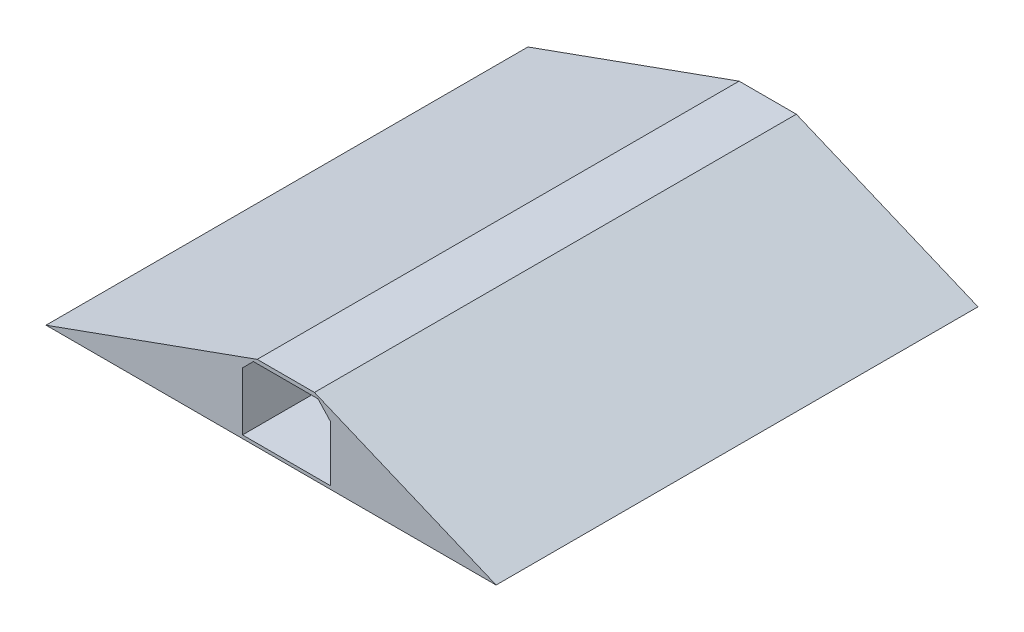
ISO-10303-21;
HEADER;
FILE_DESCRIPTION(('STEP AP214'),'2;1');
FILE_NAME('part.step','',(''),(''),'','','');
FILE_SCHEMA(('AUTOMOTIVE_DESIGN { 1 0 10303 214 1 1 1 1 }'));
ENDSEC;
DATA;
#1=APPLICATION_CONTEXT('core data for automotive mechanical design processes');
#2=APPLICATION_PROTOCOL_DEFINITION('international standard','automotive_design',2000,#1);
#3=PRODUCT_CONTEXT('',#1,'mechanical');
#4=PRODUCT('Part','Part','',(#3));
#5=PRODUCT_RELATED_PRODUCT_CATEGORY('part','',(#4));
#6=PRODUCT_DEFINITION_FORMATION('','',#4);
#7=PRODUCT_DEFINITION_CONTEXT('part definition',#1,'design');
#8=PRODUCT_DEFINITION('design','',#6,#7);
#9=PRODUCT_DEFINITION_SHAPE('','',#8);
#10=(LENGTH_UNIT() NAMED_UNIT(*) SI_UNIT(.MILLI.,.METRE.));
#11=(NAMED_UNIT(*) PLANE_ANGLE_UNIT() SI_UNIT($,.RADIAN.));
#12=(NAMED_UNIT(*) SI_UNIT($,.STERADIAN.) SOLID_ANGLE_UNIT());
#13=UNCERTAINTY_MEASURE_WITH_UNIT(LENGTH_MEASURE(1.E-05),#10,'distance_accuracy_value','');
#14=(GEOMETRIC_REPRESENTATION_CONTEXT(3) GLOBAL_UNCERTAINTY_ASSIGNED_CONTEXT((#13)) GLOBAL_UNIT_ASSIGNED_CONTEXT((#10,
#11,#12)) REPRESENTATION_CONTEXT('',''));
#15=CARTESIAN_POINT('',(0.,0.,0.));
#16=DIRECTION('',(0.,0.,1.));
#17=DIRECTION('',(1.,0.,0.));
#18=AXIS2_PLACEMENT_3D('',#15,#16,#17);
#19=CARTESIAN_POINT('',(0.,0.,55.));
#20=DIRECTION('',(0.,0.,1.));
#21=DIRECTION('',(1.,0.,0.));
#22=AXIS2_PLACEMENT_3D('',#19,#20,#21);
#23=PLANE('',#22);
#24=DIRECTION('',(1.,0.,0.));
#25=VECTOR('',#24,1.);
#26=CARTESIAN_POINT('',(-7.08566541011932,-21.0540046811793,55.));
#27=LINE('',#26,#25);
#28=CARTESIAN_POINT('',(-31.0856654101193,-21.0540046811793,55.));
#29=VERTEX_POINT('',#28);
#30=CARTESIAN_POINT('',(20.2873955088301,-21.0540046811793,55.));
#31=VERTEX_POINT('',#30);
#32=EDGE_CURVE('E163',#29,#31,#27,.T.);
#33=ORIENTED_EDGE('',*,*,#32,.T.);
#34=DIRECTION('',(-0.922510990792128,0.385970817378369,0.));
#35=VECTOR('',#34,1.);
#36=CARTESIAN_POINT('',(-0.444607291259682,-12.3799095793201,55.));
#37=LINE('',#36,#35);
#38=CARTESIAN_POINT('',(-0.444607291259682,-12.3799095793201,55.));
#39=VERTEX_POINT('',#38);
#40=EDGE_CURVE('E165',#31,#39,#37,.T.);
#41=ORIENTED_EDGE('',*,*,#40,.T.);
#42=DIRECTION('',(-1.,0.,0.));
#43=VECTOR('',#42,1.);
#44=CARTESIAN_POINT('',(-0.444607291259682,-12.3799095793201,55.));
#45=LINE('',#44,#43);
#46=CARTESIAN_POINT('',(-6.98060169108018,-12.3799095793201,55.));
#47=VERTEX_POINT('',#46);
#48=EDGE_CURVE('E168',#39,#47,#45,.T.);
#49=ORIENTED_EDGE('',*,*,#48,.T.);
#50=DIRECTION('',(-0.940933778219289,-0.338590645183789,0.));
#51=VECTOR('',#50,1.);
#52=CARTESIAN_POINT('',(-6.98060169108018,-12.3799095793201,55.));
#53=LINE('',#52,#51);
#54=EDGE_CURVE('E170',#47,#29,#53,.T.);
#55=ORIENTED_EDGE('',*,*,#54,.T.);
#56=EDGE_LOOP('',(#33,#41,#49,#55));
#57=FACE_BOUND('',#56,.T.);
#58=DIRECTION('',(0.,-1.,0.));
#59=VECTOR('',#58,1.);
#60=CARTESIAN_POINT('',(1.37926941419477,0.,55.));
#61=LINE('',#60,#59);
#62=CARTESIAN_POINT('',(1.37926941419477,-14.3364460735503,55.));
#63=VERTEX_POINT('',#62);
#64=CARTESIAN_POINT('',(1.37926941419477,-20.6878820080022,55.));
#65=VERTEX_POINT('',#64);
#66=EDGE_CURVE('E159',#63,#65,#61,.T.);
#67=ORIENTED_EDGE('',*,*,#66,.T.);
#68=DIRECTION('',(-1.,0.,0.));
#69=VECTOR('',#68,1.);
#70=CARTESIAN_POINT('',(0.,-20.6878820080022,55.));
#71=LINE('',#70,#69);
#72=CARTESIAN_POINT('',(-8.65774940623081,-20.6878820080022,55.));
#73=VERTEX_POINT('',#72);
#74=EDGE_CURVE('E113',#65,#73,#71,.T.);
#75=ORIENTED_EDGE('',*,*,#74,.T.);
#76=DIRECTION('',(0.,1.,0.));
#77=VECTOR('',#76,1.);
#78=CARTESIAN_POINT('',(-8.6577494062308,0.,55.));
#79=LINE('',#78,#77);
#80=CARTESIAN_POINT('',(-8.65774940623081,-14.0570572944707,55.));
#81=VERTEX_POINT('',#80);
#82=EDGE_CURVE('E116',#73,#81,#79,.T.);
#83=ORIENTED_EDGE('',*,*,#82,.T.);
#84=DIRECTION('',(0.707106781186541,0.707106781186554,0.));
#85=VECTOR('',#84,1.);
#86=CARTESIAN_POINT('',(2.69965394411988,-2.69965394411984,55.));
#87=LINE('',#86,#85);
#88=CARTESIAN_POINT('',(-7.41310893813959,-12.8124168263795,55.));
#89=VERTEX_POINT('',#88);
#90=EDGE_CURVE('E151',#81,#89,#87,.T.);
#91=ORIENTED_EDGE('',*,*,#90,.T.);
#92=DIRECTION('',(-1.,0.,0.));
#93=VECTOR('',#92,1.);
#94=CARTESIAN_POINT('',(0.,-12.8124168263795,55.));
#95=LINE('',#94,#93);
#96=CARTESIAN_POINT('',(-0.0414254977290474,-12.8124168263795,55.));
#97=VERTEX_POINT('',#96);
#98=EDGE_CURVE('E154',#97,#89,#95,.T.);
#99=ORIENTED_EDGE('',*,*,#98,.F.);
#100=DIRECTION('',(0.681873750867138,-0.731469881730192,0.));
#101=VECTOR('',#100,1.);
#102=CARTESIAN_POINT('',(-6.4126152117165,-5.97781822122057,55.));
#103=LINE('',#102,#101);
#104=EDGE_CURVE('E156',#97,#63,#103,.T.);
#105=ORIENTED_EDGE('',*,*,#104,.T.);
#106=EDGE_LOOP('',(#67,#75,#83,#91,#99,#105));
#107=FACE_BOUND('',#106,.T.);
#108=ADVANCED_FACE('F33',(#57,#107),#23,.T.);
#109=CARTESIAN_POINT('',(0.,0.,0.));
#110=DIRECTION('',(0.,0.,1.));
#111=DIRECTION('',(1.,0.,0.));
#112=AXIS2_PLACEMENT_3D('',#109,#110,#111);
#113=PLANE('',#112);
#114=DIRECTION('',(1.,0.,0.));
#115=VECTOR('',#114,1.);
#116=CARTESIAN_POINT('',(-7.08566541011932,-21.0540046811793,0.));
#117=LINE('',#116,#115);
#118=CARTESIAN_POINT('',(-31.0856654101193,-21.0540046811793,0.));
#119=VERTEX_POINT('',#118);
#120=CARTESIAN_POINT('',(20.2873955088301,-21.0540046811793,0.));
#121=VERTEX_POINT('',#120);
#122=EDGE_CURVE('E162',#119,#121,#117,.T.);
#123=ORIENTED_EDGE('',*,*,#122,.F.);
#124=DIRECTION('',(-0.940933778219289,-0.338590645183789,0.));
#125=VECTOR('',#124,1.);
#126=CARTESIAN_POINT('',(-6.98060169108018,-12.3799095793201,0.));
#127=LINE('',#126,#125);
#128=CARTESIAN_POINT('',(-6.98060169108018,-12.3799095793201,0.));
#129=VERTEX_POINT('',#128);
#130=EDGE_CURVE('E166',#129,#119,#127,.T.);
#131=ORIENTED_EDGE('',*,*,#130,.F.);
#132=DIRECTION('',(-1.,0.,0.));
#133=VECTOR('',#132,1.);
#134=CARTESIAN_POINT('',(-0.444607291259682,-12.3799095793201,0.));
#135=LINE('',#134,#133);
#136=CARTESIAN_POINT('',(-0.444607291259682,-12.3799095793201,0.));
#137=VERTEX_POINT('',#136);
#138=EDGE_CURVE('E176',#137,#129,#135,.T.);
#139=ORIENTED_EDGE('',*,*,#138,.F.);
#140=DIRECTION('',(-0.922510990792128,0.385970817378369,0.));
#141=VECTOR('',#140,1.);
#142=CARTESIAN_POINT('',(-0.444607291259682,-12.3799095793201,0.));
#143=LINE('',#142,#141);
#144=EDGE_CURVE('E174',#121,#137,#143,.T.);
#145=ORIENTED_EDGE('',*,*,#144,.F.);
#146=EDGE_LOOP('',(#123,#131,#139,#145));
#147=FACE_BOUND('',#146,.T.);
#148=DIRECTION('',(1.,0.,0.));
#149=VECTOR('',#148,1.);
#150=CARTESIAN_POINT('',(-8.65774940623081,-20.6878820080022,0.));
#151=LINE('',#150,#149);
#152=CARTESIAN_POINT('',(-8.65774940623081,-20.6878820080022,0.));
#153=VERTEX_POINT('',#152);
#154=CARTESIAN_POINT('',(1.37926941419477,-20.6878820080022,0.));
#155=VERTEX_POINT('',#154);
#156=EDGE_CURVE('E56',#153,#155,#151,.T.);
#157=ORIENTED_EDGE('',*,*,#156,.T.);
#158=DIRECTION('',(0.,1.,0.));
#159=VECTOR('',#158,1.);
#160=CARTESIAN_POINT('',(1.37926941419477,-20.6878820080022,0.));
#161=LINE('',#160,#159);
#162=CARTESIAN_POINT('',(1.37926941419477,-14.3364460735503,0.));
#163=VERTEX_POINT('',#162);
#164=EDGE_CURVE('E120',#155,#163,#161,.T.);
#165=ORIENTED_EDGE('',*,*,#164,.T.);
#166=DIRECTION('',(-0.681873750867138,0.731469881730191,0.));
#167=VECTOR('',#166,1.);
#168=CARTESIAN_POINT('',(1.37926941419477,-14.3364460735503,0.));
#169=LINE('',#168,#167);
#170=CARTESIAN_POINT('',(-0.0414254977290474,-12.8124168263795,0.));
#171=VERTEX_POINT('',#170);
#172=EDGE_CURVE('E126',#163,#171,#169,.T.);
#173=ORIENTED_EDGE('',*,*,#172,.T.);
#174=DIRECTION('',(1.,0.,0.));
#175=VECTOR('',#174,1.);
#176=CARTESIAN_POINT('',(-7.41310893813959,-12.8124168263795,0.));
#177=LINE('',#176,#175);
#178=CARTESIAN_POINT('',(-7.41310893813959,-12.8124168263795,0.));
#179=VERTEX_POINT('',#178);
#180=EDGE_CURVE('E135',#179,#171,#177,.T.);
#181=ORIENTED_EDGE('',*,*,#180,.F.);
#182=DIRECTION('',(-0.707106781186541,-0.707106781186554,0.));
#183=VECTOR('',#182,1.);
#184=CARTESIAN_POINT('',(-7.41310893813959,-12.8124168263795,0.));
#185=LINE('',#184,#183);
#186=CARTESIAN_POINT('',(-8.65774940623081,-14.0570572944707,0.));
#187=VERTEX_POINT('',#186);
#188=EDGE_CURVE('E138',#179,#187,#185,.T.);
#189=ORIENTED_EDGE('',*,*,#188,.T.);
#190=DIRECTION('',(0.,-1.,0.));
#191=VECTOR('',#190,1.);
#192=CARTESIAN_POINT('',(-8.65774940623081,-14.0570572944707,0.));
#193=LINE('',#192,#191);
#194=EDGE_CURVE('E131',#187,#153,#193,.T.);
#195=ORIENTED_EDGE('',*,*,#194,.T.);
#196=EDGE_LOOP('',(#157,#165,#173,#181,#189,#195));
#197=FACE_BOUND('',#196,.T.);
#198=ADVANCED_FACE('F129',(#147,#197),#113,.F.);
#199=CARTESIAN_POINT('',(-7.08566541011932,-21.0540046811793,55.));
#200=DIRECTION('',(0.,1.,0.));
#201=DIRECTION('',(0.,0.,1.));
#202=AXIS2_PLACEMENT_3D('',#199,#200,#201);
#203=PLANE('',#202);
#204=ORIENTED_EDGE('',*,*,#122,.T.);
#205=DIRECTION('',(0.,0.,-1.));
#206=VECTOR('',#205,1.);
#207=CARTESIAN_POINT('',(20.2873955088301,-21.0540046811793,55.));
#208=LINE('',#207,#206);
#209=EDGE_CURVE('E11',#31,#121,#208,.T.);
#210=ORIENTED_EDGE('',*,*,#209,.F.);
#211=ORIENTED_EDGE('',*,*,#32,.F.);
#212=DIRECTION('',(0.,0.,-1.));
#213=VECTOR('',#212,1.);
#214=CARTESIAN_POINT('',(-31.0856654101193,-21.0540046811793,55.));
#215=LINE('',#214,#213);
#216=EDGE_CURVE('E172',#29,#119,#215,.T.);
#217=ORIENTED_EDGE('',*,*,#216,.T.);
#218=EDGE_LOOP('',(#204,#210,#211,#217));
#219=FACE_BOUND('',#218,.T.);
#220=ADVANCED_FACE('F35',(#219),#203,.F.);
#221=CARTESIAN_POINT('',(-0.444607291259682,-12.3799095793201,55.));
#222=DIRECTION('',(-0.385970817378369,-0.922510990792128,0.));
#223=DIRECTION('',(0.922510990792128,-0.385970817378369,0.));
#224=AXIS2_PLACEMENT_3D('',#221,#222,#223);
#225=PLANE('',#224);
#226=ORIENTED_EDGE('',*,*,#144,.T.);
#227=DIRECTION('',(0.,0.,-1.));
#228=VECTOR('',#227,1.);
#229=CARTESIAN_POINT('',(-0.444607291259682,-12.3799095793201,55.));
#230=LINE('',#229,#228);
#231=EDGE_CURVE('E41',#39,#137,#230,.T.);
#232=ORIENTED_EDGE('',*,*,#231,.F.);
#233=ORIENTED_EDGE('',*,*,#40,.F.);
#234=ORIENTED_EDGE('',*,*,#209,.T.);
#235=EDGE_LOOP('',(#226,#232,#233,#234));
#236=FACE_BOUND('',#235,.T.);
#237=ADVANCED_FACE('F205',(#236),#225,.F.);
#238=CARTESIAN_POINT('',(-0.444607291259682,-12.3799095793201,55.));
#239=DIRECTION('',(0.,-1.,0.));
#240=DIRECTION('',(0.,0.,-1.));
#241=AXIS2_PLACEMENT_3D('',#238,#239,#240);
#242=PLANE('',#241);
#243=ORIENTED_EDGE('',*,*,#138,.T.);
#244=DIRECTION('',(0.,0.,-1.));
#245=VECTOR('',#244,1.);
#246=CARTESIAN_POINT('',(-6.98060169108018,-12.3799095793201,55.));
#247=LINE('',#246,#245);
#248=EDGE_CURVE('E182',#47,#129,#247,.T.);
#249=ORIENTED_EDGE('',*,*,#248,.F.);
#250=ORIENTED_EDGE('',*,*,#48,.F.);
#251=ORIENTED_EDGE('',*,*,#231,.T.);
#252=EDGE_LOOP('',(#243,#249,#250,#251));
#253=FACE_BOUND('',#252,.T.);
#254=ADVANCED_FACE('F189',(#253),#242,.F.);
#255=CARTESIAN_POINT('',(-6.98060169108018,-12.3799095793201,55.));
#256=DIRECTION('',(0.338590645183789,-0.940933778219289,0.));
#257=DIRECTION('',(0.940933778219289,0.338590645183789,0.));
#258=AXIS2_PLACEMENT_3D('',#255,#256,#257);
#259=PLANE('',#258);
#260=ORIENTED_EDGE('',*,*,#130,.T.);
#261=ORIENTED_EDGE('',*,*,#216,.F.);
#262=ORIENTED_EDGE('',*,*,#54,.F.);
#263=ORIENTED_EDGE('',*,*,#248,.T.);
#264=EDGE_LOOP('',(#260,#261,#262,#263));
#265=FACE_BOUND('',#264,.T.);
#266=ADVANCED_FACE('F198',(#265),#259,.F.);
#267=CARTESIAN_POINT('',(-8.65774940623081,-20.6878820080022,68.));
#268=DIRECTION('',(0.,1.,0.));
#269=DIRECTION('',(0.,0.,1.));
#270=AXIS2_PLACEMENT_3D('',#267,#268,#269);
#271=PLANE('',#270);
#272=DIRECTION('',(0.,0.,-1.));
#273=VECTOR('',#272,1.);
#274=CARTESIAN_POINT('',(1.37926941419477,-20.6878820080022,68.));
#275=LINE('',#274,#273);
#276=EDGE_CURVE('E109',#65,#155,#275,.T.);
#277=ORIENTED_EDGE('',*,*,#276,.T.);
#278=ORIENTED_EDGE('',*,*,#156,.F.);
#279=DIRECTION('',(0.,0.,-1.));
#280=VECTOR('',#279,1.);
#281=CARTESIAN_POINT('',(-8.65774940623081,-20.6878820080022,68.));
#282=LINE('',#281,#280);
#283=EDGE_CURVE('E141',#73,#153,#282,.T.);
#284=ORIENTED_EDGE('',*,*,#283,.F.);
#285=ORIENTED_EDGE('',*,*,#74,.F.);
#286=EDGE_LOOP('',(#277,#278,#284,#285));
#287=FACE_BOUND('',#286,.T.);
#288=ADVANCED_FACE('F111',(#287),#271,.T.);
#289=CARTESIAN_POINT('',(1.37926941419477,-20.6878820080022,68.));
#290=DIRECTION('',(-1.,0.,0.));
#291=DIRECTION('',(0.,0.,1.));
#292=AXIS2_PLACEMENT_3D('',#289,#290,#291);
#293=PLANE('',#292);
#294=DIRECTION('',(0.,0.,-1.));
#295=VECTOR('',#294,1.);
#296=CARTESIAN_POINT('',(1.37926941419477,-14.3364460735503,68.));
#297=LINE('',#296,#295);
#298=EDGE_CURVE('E117',#63,#163,#297,.T.);
#299=ORIENTED_EDGE('',*,*,#298,.T.);
#300=ORIENTED_EDGE('',*,*,#164,.F.);
#301=ORIENTED_EDGE('',*,*,#276,.F.);
#302=ORIENTED_EDGE('',*,*,#66,.F.);
#303=EDGE_LOOP('',(#299,#300,#301,#302));
#304=FACE_BOUND('',#303,.T.);
#305=ADVANCED_FACE('F121',(#304),#293,.T.);
#306=CARTESIAN_POINT('',(1.37926941419477,-14.3364460735503,68.));
#307=DIRECTION('',(-0.731469881730192,-0.681873750867138,0.));
#308=DIRECTION('',(0.681873750867138,-0.731469881730192,0.));
#309=AXIS2_PLACEMENT_3D('',#306,#307,#308);
#310=PLANE('',#309);
#311=DIRECTION('',(0.,0.,-1.));
#312=VECTOR('',#311,1.);
#313=CARTESIAN_POINT('',(-0.0414254977290474,-12.8124168263795,68.));
#314=LINE('',#313,#312);
#315=EDGE_CURVE('E146',#97,#171,#314,.T.);
#316=ORIENTED_EDGE('',*,*,#315,.T.);
#317=ORIENTED_EDGE('',*,*,#172,.F.);
#318=ORIENTED_EDGE('',*,*,#298,.F.);
#319=ORIENTED_EDGE('',*,*,#104,.F.);
#320=EDGE_LOOP('',(#316,#317,#318,#319));
#321=FACE_BOUND('',#320,.T.);
#322=ADVANCED_FACE('F228',(#321),#310,.T.);
#323=CARTESIAN_POINT('',(-7.41310893813959,-12.8124168263795,68.));
#324=DIRECTION('',(0.,1.,0.));
#325=DIRECTION('',(-1.,0.,0.));
#326=AXIS2_PLACEMENT_3D('',#323,#324,#325);
#327=PLANE('',#326);
#328=ORIENTED_EDGE('',*,*,#98,.T.);
#329=DIRECTION('',(0.,0.,-1.));
#330=VECTOR('',#329,1.);
#331=CARTESIAN_POINT('',(-7.41310893813959,-12.8124168263795,68.));
#332=LINE('',#331,#330);
#333=EDGE_CURVE('E144',#89,#179,#332,.T.);
#334=ORIENTED_EDGE('',*,*,#333,.T.);
#335=ORIENTED_EDGE('',*,*,#180,.T.);
#336=ORIENTED_EDGE('',*,*,#315,.F.);
#337=EDGE_LOOP('',(#328,#334,#335,#336));
#338=FACE_BOUND('',#337,.T.);
#339=ADVANCED_FACE('F232',(#338),#327,.F.);
#340=CARTESIAN_POINT('',(-7.41310893813959,-12.8124168263795,68.));
#341=DIRECTION('',(0.707106781186554,-0.707106781186541,0.));
#342=DIRECTION('',(0.707106781186541,0.707106781186554,0.));
#343=AXIS2_PLACEMENT_3D('',#340,#341,#342);
#344=PLANE('',#343);
#345=DIRECTION('',(0.,0.,-1.));
#346=VECTOR('',#345,1.);
#347=CARTESIAN_POINT('',(-8.65774940623081,-14.0570572944707,68.));
#348=LINE('',#347,#346);
#349=EDGE_CURVE('E48',#81,#187,#348,.T.);
#350=ORIENTED_EDGE('',*,*,#349,.T.);
#351=ORIENTED_EDGE('',*,*,#188,.F.);
#352=ORIENTED_EDGE('',*,*,#333,.F.);
#353=ORIENTED_EDGE('',*,*,#90,.F.);
#354=EDGE_LOOP('',(#350,#351,#352,#353));
#355=FACE_BOUND('',#354,.T.);
#356=ADVANCED_FACE('F238',(#355),#344,.T.);
#357=CARTESIAN_POINT('',(-8.65774940623081,-14.0570572944707,68.));
#358=DIRECTION('',(1.,0.,0.));
#359=DIRECTION('',(0.,1.,0.));
#360=AXIS2_PLACEMENT_3D('',#357,#358,#359);
#361=PLANE('',#360);
#362=ORIENTED_EDGE('',*,*,#283,.T.);
#363=ORIENTED_EDGE('',*,*,#194,.F.);
#364=ORIENTED_EDGE('',*,*,#349,.F.);
#365=ORIENTED_EDGE('',*,*,#82,.F.);
#366=EDGE_LOOP('',(#362,#363,#364,#365));
#367=FACE_BOUND('',#366,.T.);
#368=ADVANCED_FACE('F242',(#367),#361,.T.);
#369=CLOSED_SHELL('',(#108,#198,#220,#237,#254,#266,#288,#305,#322,#339,#356,#368));
#370=MANIFOLD_SOLID_BREP('B2',#369);
#371=ADVANCED_BREP_SHAPE_REPRESENTATION('',(#18,#370),#14);
#372=SHAPE_DEFINITION_REPRESENTATION(#9,#371);
ENDSEC;
END-ISO-10303-21;
